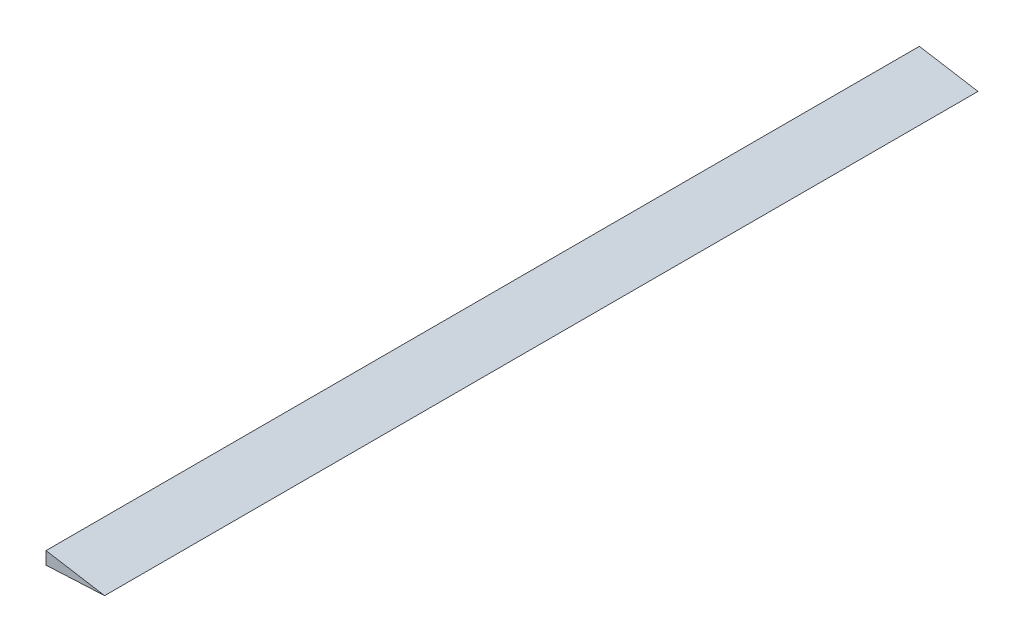
ISO-10303-21;
HEADER;
FILE_DESCRIPTION(('STEP AP214'),'2;1');
FILE_NAME('part.step','',(''),(''),'','','');
FILE_SCHEMA(('AUTOMOTIVE_DESIGN { 1 0 10303 214 1 1 1 1 }'));
ENDSEC;
DATA;
#1=APPLICATION_CONTEXT('core data for automotive mechanical design processes');
#2=APPLICATION_PROTOCOL_DEFINITION('international standard','automotive_design',2000,#1);
#3=PRODUCT_CONTEXT('',#1,'mechanical');
#4=PRODUCT('Part','Part','',(#3));
#5=PRODUCT_RELATED_PRODUCT_CATEGORY('part','',(#4));
#6=PRODUCT_DEFINITION_FORMATION('','',#4);
#7=PRODUCT_DEFINITION_CONTEXT('part definition',#1,'design');
#8=PRODUCT_DEFINITION('design','',#6,#7);
#9=PRODUCT_DEFINITION_SHAPE('','',#8);
#10=(LENGTH_UNIT() NAMED_UNIT(*) SI_UNIT(.MILLI.,.METRE.));
#11=(NAMED_UNIT(*) PLANE_ANGLE_UNIT() SI_UNIT($,.RADIAN.));
#12=(NAMED_UNIT(*) SI_UNIT($,.STERADIAN.) SOLID_ANGLE_UNIT());
#13=UNCERTAINTY_MEASURE_WITH_UNIT(LENGTH_MEASURE(1.E-05),#10,'distance_accuracy_value','');
#14=(GEOMETRIC_REPRESENTATION_CONTEXT(3) GLOBAL_UNCERTAINTY_ASSIGNED_CONTEXT((#13)) GLOBAL_UNIT_ASSIGNED_CONTEXT((#10,
#11,#12)) REPRESENTATION_CONTEXT('',''));
#15=CARTESIAN_POINT('',(0.,0.,0.));
#16=DIRECTION('',(0.,0.,1.));
#17=DIRECTION('',(1.,0.,0.));
#18=AXIS2_PLACEMENT_3D('',#15,#16,#17);
#19=CARTESIAN_POINT('',(306.849576799999,-2.51611574111238,46.8901119515539));
#20=DIRECTION('',(0.0494691955585382,-0.998775649828725,0.));
#21=DIRECTION('',(0.998775649828725,0.0494691955585382,0.));
#22=AXIS2_PLACEMENT_3D('',#19,#20,#21);
#23=PLANE('',#22);
#24=DIRECTION('',(0.998775649828725,0.0494691955585382,0.));
#25=VECTOR('',#24,1.);
#26=CARTESIAN_POINT('',(306.849576799999,-2.51611574111238,-5.07999999999997));
#27=LINE('',#26,#25);
#28=CARTESIAN_POINT('',(306.849576799999,-2.51611574111238,-5.07999999999997));
#29=VERTEX_POINT('',#28);
#30=CARTESIAN_POINT('',(357.6495768,0.,-5.07999999999997));
#31=VERTEX_POINT('',#30);
#32=EDGE_CURVE('E41',#29,#31,#27,.T.);
#33=ORIENTED_EDGE('',*,*,#32,.F.);
#34=DIRECTION('',(0.,0.,-1.));
#35=VECTOR('',#34,1.);
#36=CARTESIAN_POINT('',(306.849576799999,-2.51611574111238,46.8901119515539));
#37=LINE('',#36,#35);
#38=CARTESIAN_POINT('',(306.849576799999,-2.51611574111238,-761.999746));
#39=VERTEX_POINT('',#38);
#40=EDGE_CURVE('E63',#29,#39,#37,.T.);
#41=ORIENTED_EDGE('',*,*,#40,.T.);
#42=DIRECTION('',(-0.998775649828725,-0.0494691955585382,0.));
#43=VECTOR('',#42,1.);
#44=CARTESIAN_POINT('',(306.849576799999,-2.51611574111238,-761.999746));
#45=LINE('',#44,#43);
#46=CARTESIAN_POINT('',(357.6495768,0.,-761.999746));
#47=VERTEX_POINT('',#46);
#48=EDGE_CURVE('E67',#47,#39,#45,.T.);
#49=ORIENTED_EDGE('',*,*,#48,.F.);
#50=DIRECTION('',(0.,0.,-1.));
#51=VECTOR('',#50,1.);
#52=CARTESIAN_POINT('',(357.6495768,0.,46.8901119515539));
#53=LINE('',#52,#51);
#54=EDGE_CURVE('E85',#31,#47,#53,.T.);
#55=ORIENTED_EDGE('',*,*,#54,.F.);
#56=EDGE_LOOP('',(#33,#41,#49,#55));
#57=FACE_BOUND('',#56,.T.);
#58=ADVANCED_FACE('F34',(#57),#23,.T.);
#59=CARTESIAN_POINT('',(306.8495768,8.44985600136988,46.8901119515539));
#60=DIRECTION('',(0.164081367708129,0.986446807877156,0.));
#61=DIRECTION('',(-0.986446807877156,0.164081367708129,0.));
#62=AXIS2_PLACEMENT_3D('',#59,#60,#61);
#63=PLANE('',#62);
#64=DIRECTION('',(-0.986446807877156,0.164081367708129,0.));
#65=VECTOR('',#64,1.);
#66=CARTESIAN_POINT('',(306.8495768,8.44985600136988,-5.07999999999997));
#67=LINE('',#66,#65);
#68=CARTESIAN_POINT('',(306.8495768,8.44985600136988,-5.07999999999997));
#69=VERTEX_POINT('',#68);
#70=EDGE_CURVE('E87',#31,#69,#67,.T.);
#71=ORIENTED_EDGE('',*,*,#70,.F.);
#72=ORIENTED_EDGE('',*,*,#54,.T.);
#73=DIRECTION('',(0.986446807877156,-0.164081367708129,0.));
#74=VECTOR('',#73,1.);
#75=CARTESIAN_POINT('',(306.8495768,8.44985600136988,-761.999746));
#76=LINE('',#75,#74);
#77=CARTESIAN_POINT('',(306.8495768,8.44985600136988,-761.999746));
#78=VERTEX_POINT('',#77);
#79=EDGE_CURVE('E71',#78,#47,#76,.T.);
#80=ORIENTED_EDGE('',*,*,#79,.F.);
#81=DIRECTION('',(0.,0.,-1.));
#82=VECTOR('',#81,1.);
#83=CARTESIAN_POINT('',(306.8495768,8.44985600136988,46.8901119515539));
#84=LINE('',#83,#82);
#85=EDGE_CURVE('E70',#69,#78,#84,.T.);
#86=ORIENTED_EDGE('',*,*,#85,.F.);
#87=EDGE_LOOP('',(#71,#72,#80,#86));
#88=FACE_BOUND('',#87,.T.);
#89=ADVANCED_FACE('F90',(#88),#63,.T.);
#90=CARTESIAN_POINT('',(306.849576799999,-2.51611574111238,46.8901119515539));
#91=DIRECTION('',(-1.,1.16428941119077E-13,0.));
#92=DIRECTION('',(-1.16428941119077E-13,-1.,0.));
#93=AXIS2_PLACEMENT_3D('',#90,#91,#92);
#94=PLANE('',#93);
#95=DIRECTION('',(-1.16428941119077E-13,-1.,0.));
#96=VECTOR('',#95,1.);
#97=CARTESIAN_POINT('',(306.849576799999,-2.51611574111238,-5.07999999999997));
#98=LINE('',#97,#96);
#99=EDGE_CURVE('E11',#69,#29,#98,.T.);
#100=ORIENTED_EDGE('',*,*,#99,.F.);
#101=ORIENTED_EDGE('',*,*,#85,.T.);
#102=DIRECTION('',(1.16428941119077E-13,1.,0.));
#103=VECTOR('',#102,1.);
#104=CARTESIAN_POINT('',(306.849576799999,-2.51611574111238,-761.999746));
#105=LINE('',#104,#103);
#106=EDGE_CURVE('E73',#39,#78,#105,.T.);
#107=ORIENTED_EDGE('',*,*,#106,.F.);
#108=ORIENTED_EDGE('',*,*,#40,.F.);
#109=EDGE_LOOP('',(#100,#101,#107,#108));
#110=FACE_BOUND('',#109,.T.);
#111=ADVANCED_FACE('F74',(#110),#94,.T.);
#112=CARTESIAN_POINT('',(0.,0.,-761.999746));
#113=DIRECTION('',(0.,0.,1.));
#114=DIRECTION('',(1.,0.,0.));
#115=AXIS2_PLACEMENT_3D('',#112,#113,#114);
#116=PLANE('',#115);
#117=ORIENTED_EDGE('',*,*,#48,.T.);
#118=ORIENTED_EDGE('',*,*,#106,.T.);
#119=ORIENTED_EDGE('',*,*,#79,.T.);
#120=EDGE_LOOP('',(#117,#118,#119));
#121=FACE_BOUND('',#120,.T.);
#122=ADVANCED_FACE('F79',(#121),#116,.F.);
#123=CARTESIAN_POINT('',(1.2677296123001,2.86302360731042,-5.07999999999997));
#124=DIRECTION('',(0.,0.,-1.));
#125=DIRECTION('',(-1.,0.,0.));
#126=AXIS2_PLACEMENT_3D('',#123,#124,#125);
#127=PLANE('',#126);
#128=ORIENTED_EDGE('',*,*,#32,.T.);
#129=ORIENTED_EDGE('',*,*,#70,.T.);
#130=ORIENTED_EDGE('',*,*,#99,.T.);
#131=EDGE_LOOP('',(#128,#129,#130));
#132=FACE_BOUND('',#131,.T.);
#133=ADVANCED_FACE('F89',(#132),#127,.F.);
#134=CLOSED_SHELL('',(#58,#89,#111,#122,#133));
#135=MANIFOLD_SOLID_BREP('B2',#134);
#136=ADVANCED_BREP_SHAPE_REPRESENTATION('',(#18,#135),#14);
#137=SHAPE_DEFINITION_REPRESENTATION(#9,#136);
ENDSEC;
END-ISO-10303-21;
